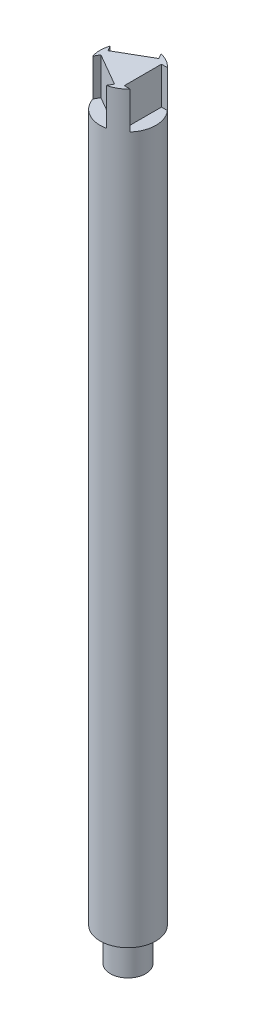
ISO-10303-21;
HEADER;
FILE_DESCRIPTION(('STEP AP214'),'2;1');
FILE_NAME('part.step','',(''),(''),'','','');
FILE_SCHEMA(('AUTOMOTIVE_DESIGN { 1 0 10303 214 1 1 1 1 }'));
ENDSEC;
DATA;
#1=APPLICATION_CONTEXT('core data for automotive mechanical design processes');
#2=APPLICATION_PROTOCOL_DEFINITION('international standard','automotive_design',2000,#1);
#3=PRODUCT_CONTEXT('',#1,'mechanical');
#4=PRODUCT('Part','Part','',(#3));
#5=PRODUCT_RELATED_PRODUCT_CATEGORY('part','',(#4));
#6=PRODUCT_DEFINITION_FORMATION('','',#4);
#7=PRODUCT_DEFINITION_CONTEXT('part definition',#1,'design');
#8=PRODUCT_DEFINITION('design','',#6,#7);
#9=PRODUCT_DEFINITION_SHAPE('','',#8);
#10=(LENGTH_UNIT() NAMED_UNIT(*) SI_UNIT(.MILLI.,.METRE.));
#11=(NAMED_UNIT(*) PLANE_ANGLE_UNIT() SI_UNIT($,.RADIAN.));
#12=(NAMED_UNIT(*) SI_UNIT($,.STERADIAN.) SOLID_ANGLE_UNIT());
#13=UNCERTAINTY_MEASURE_WITH_UNIT(LENGTH_MEASURE(1.E-05),#10,'distance_accuracy_value','');
#14=(GEOMETRIC_REPRESENTATION_CONTEXT(3) GLOBAL_UNCERTAINTY_ASSIGNED_CONTEXT((#13)) GLOBAL_UNIT_ASSIGNED_CONTEXT((#10,
#11,#12)) REPRESENTATION_CONTEXT('',''));
#15=CARTESIAN_POINT('',(0.,0.,0.));
#16=DIRECTION('',(0.,0.,1.));
#17=DIRECTION('',(1.,0.,0.));
#18=AXIS2_PLACEMENT_3D('',#15,#16,#17);
#19=CARTESIAN_POINT('',(0.,209.,0.));
#20=DIRECTION('',(0.,-1.,0.));
#21=DIRECTION('',(0.,0.,-1.));
#22=AXIS2_PLACEMENT_3D('',#19,#20,#21);
#23=CYLINDRICAL_SURFACE('',#22,7.5);
#24=CARTESIAN_POINT('',(0.,9.,0.));
#25=DIRECTION('',(0.,1.,0.));
#26=DIRECTION('',(0.,0.,1.));
#27=AXIS2_PLACEMENT_3D('',#24,#25,#26);
#28=CIRCLE('',#27,7.5);
#29=CARTESIAN_POINT('',(0.,9.,7.5));
#30=VERTEX_POINT('',#29);
#31=EDGE_CURVE('E227',#30,#30,#28,.T.);
#32=ORIENTED_EDGE('',*,*,#31,.T.);
#33=EDGE_LOOP('',(#32));
#34=FACE_BOUND('',#33,.T.);
#35=DIRECTION('',(0.,-1.,0.));
#36=VECTOR('',#35,1.);
#37=CARTESIAN_POINT('',(1.53504204704742,209.,7.34122918275928));
#38=LINE('',#37,#36);
#39=CARTESIAN_POINT('',(1.53504204704742,199.,7.34122918275928));
#40=VERTEX_POINT('',#39);
#41=CARTESIAN_POINT('',(1.53504204704742,209.,7.34122918275928));
#42=VERTEX_POINT('',#41);
#43=EDGE_CURVE('E193',#40,#42,#38,.F.);
#44=ORIENTED_EDGE('',*,*,#43,.F.);
#45=CARTESIAN_POINT('',(0.,199.,0.));
#46=DIRECTION('',(0.,1.,0.));
#47=DIRECTION('',(0.,0.,1.));
#48=AXIS2_PLACEMENT_3D('',#45,#46,#47);
#49=CIRCLE('',#48,7.5);
#50=CARTESIAN_POINT('',(-7.12521199079694,199.,2.34122918275924));
#51=VERTEX_POINT('',#50);
#52=EDGE_CURVE('E11',#51,#40,#49,.T.);
#53=ORIENTED_EDGE('',*,*,#52,.F.);
#54=DIRECTION('',(0.,-1.,0.));
#55=VECTOR('',#54,1.);
#56=CARTESIAN_POINT('',(-7.12521199079694,209.,2.34122918275924));
#57=LINE('',#56,#55);
#58=CARTESIAN_POINT('',(-7.12521199079694,209.,2.34122918275924));
#59=VERTEX_POINT('',#58);
#60=EDGE_CURVE('E188',#59,#51,#57,.T.);
#61=ORIENTED_EDGE('',*,*,#60,.F.);
#62=CARTESIAN_POINT('',(0.,209.,0.));
#63=DIRECTION('',(0.,1.,0.));
#64=DIRECTION('',(0.,0.,1.));
#65=AXIS2_PLACEMENT_3D('',#62,#63,#64);
#66=CIRCLE('',#65,7.5);
#67=CARTESIAN_POINT('',(-7.12521199079691,209.,-2.34122918275934));
#68=VERTEX_POINT('',#67);
#69=EDGE_CURVE('E157',#68,#59,#66,.T.);
#70=ORIENTED_EDGE('',*,*,#69,.F.);
#71=DIRECTION('',(0.,-1.,0.));
#72=VECTOR('',#71,1.);
#73=CARTESIAN_POINT('',(-7.12521199079691,209.,-2.34122918275934));
#74=LINE('',#73,#72);
#75=CARTESIAN_POINT('',(-7.12521199079691,199.,-2.34122918275934));
#76=VERTEX_POINT('',#75);
#77=EDGE_CURVE('E182',#76,#68,#74,.F.);
#78=ORIENTED_EDGE('',*,*,#77,.F.);
#79=CARTESIAN_POINT('',(0.,199.,0.));
#80=DIRECTION('',(0.,1.,0.));
#81=DIRECTION('',(0.,0.,1.));
#82=AXIS2_PLACEMENT_3D('',#79,#80,#81);
#83=CIRCLE('',#82,7.5);
#84=CARTESIAN_POINT('',(1.53504204704752,199.,-7.34122918275926));
#85=VERTEX_POINT('',#84);
#86=EDGE_CURVE('E53',#85,#76,#83,.T.);
#87=ORIENTED_EDGE('',*,*,#86,.F.);
#88=DIRECTION('',(0.,-1.,0.));
#89=VECTOR('',#88,1.);
#90=CARTESIAN_POINT('',(1.53504204704752,209.,-7.34122918275926));
#91=LINE('',#90,#89);
#92=CARTESIAN_POINT('',(1.53504204704752,209.,-7.34122918275926));
#93=VERTEX_POINT('',#92);
#94=EDGE_CURVE('E189',#93,#85,#91,.T.);
#95=ORIENTED_EDGE('',*,*,#94,.F.);
#96=CARTESIAN_POINT('',(5.59016994374948,209.,-5.));
#97=VERTEX_POINT('',#96);
#98=EDGE_CURVE('E228',#97,#93,#66,.T.);
#99=ORIENTED_EDGE('',*,*,#98,.F.);
#100=DIRECTION('',(0.,-1.,0.));
#101=VECTOR('',#100,1.);
#102=CARTESIAN_POINT('',(5.59016994374947,209.,-5.));
#103=LINE('',#102,#101);
#104=CARTESIAN_POINT('',(5.59016994374947,199.,-5.));
#105=VERTEX_POINT('',#104);
#106=EDGE_CURVE('E224',#105,#97,#103,.F.);
#107=ORIENTED_EDGE('',*,*,#106,.F.);
#108=CARTESIAN_POINT('',(0.,199.,0.));
#109=DIRECTION('',(0.,1.,0.));
#110=DIRECTION('',(0.,0.,1.));
#111=AXIS2_PLACEMENT_3D('',#108,#109,#110);
#112=CIRCLE('',#111,7.5);
#113=CARTESIAN_POINT('',(5.59016994374947,199.,5.));
#114=VERTEX_POINT('',#113);
#115=EDGE_CURVE('E252',#114,#105,#112,.T.);
#116=ORIENTED_EDGE('',*,*,#115,.F.);
#117=DIRECTION('',(0.,-1.,0.));
#118=VECTOR('',#117,1.);
#119=CARTESIAN_POINT('',(5.59016994374947,209.,5.));
#120=LINE('',#119,#118);
#121=CARTESIAN_POINT('',(5.59016994374948,209.,5.));
#122=VERTEX_POINT('',#121);
#123=EDGE_CURVE('E220',#122,#114,#120,.T.);
#124=ORIENTED_EDGE('',*,*,#123,.F.);
#125=EDGE_CURVE('E233',#42,#122,#66,.T.);
#126=ORIENTED_EDGE('',*,*,#125,.F.);
#127=EDGE_LOOP('',(#44,#53,#61,#70,#78,#87,#95,#99,#107,#116,#124,#126));
#128=FACE_BOUND('',#127,.T.);
#129=ADVANCED_FACE('F44',(#34,#128),#23,.T.);
#130=CARTESIAN_POINT('',(0.,209.,0.));
#131=DIRECTION('',(0.,1.,0.));
#132=DIRECTION('',(0.,0.,1.));
#133=AXIS2_PLACEMENT_3D('',#130,#131,#132);
#134=PLANE('',#133);
#135=DIRECTION('',(-0.866025403784436,0.,-0.500000000000004));
#136=VECTOR('',#135,1.);
#137=CARTESIAN_POINT('',(-6.3301270189222,209.,0.964101615137725));
#138=LINE('',#137,#136);
#139=CARTESIAN_POINT('',(2.33012701892217,209.,5.96410161513777));
#140=VERTEX_POINT('',#139);
#141=CARTESIAN_POINT('',(-6.3301270189222,209.,0.964101615137725));
#142=VERTEX_POINT('',#141);
#143=EDGE_CURVE('E134',#140,#142,#138,.T.);
#144=ORIENTED_EDGE('',*,*,#143,.F.);
#145=DIRECTION('',(-0.500000000000004,0.,0.866025403784436));
#146=VECTOR('',#145,1.);
#147=CARTESIAN_POINT('',(4.33012701892218,209.,2.50000000000002));
#148=LINE('',#147,#146);
#149=EDGE_CURVE('E159',#140,#42,#148,.T.);
#150=ORIENTED_EDGE('',*,*,#149,.T.);
#151=ORIENTED_EDGE('',*,*,#125,.T.);
#152=DIRECTION('',(-1.,0.,0.));
#153=VECTOR('',#152,1.);
#154=CARTESIAN_POINT('',(0.,209.,5.));
#155=LINE('',#154,#153);
#156=CARTESIAN_POINT('',(4.,209.,5.));
#157=VERTEX_POINT('',#156);
#158=EDGE_CURVE('E241',#122,#157,#155,.T.);
#159=ORIENTED_EDGE('',*,*,#158,.T.);
#160=DIRECTION('',(0.,0.,1.));
#161=VECTOR('',#160,1.);
#162=CARTESIAN_POINT('',(4.,209.,5.));
#163=LINE('',#162,#161);
#164=CARTESIAN_POINT('',(4.,209.,-5.));
#165=VERTEX_POINT('',#164);
#166=EDGE_CURVE('E203',#165,#157,#163,.T.);
#167=ORIENTED_EDGE('',*,*,#166,.F.);
#168=DIRECTION('',(1.,0.,0.));
#169=VECTOR('',#168,1.);
#170=CARTESIAN_POINT('',(0.,209.,-5.));
#171=LINE('',#170,#169);
#172=EDGE_CURVE('E248',#165,#97,#171,.T.);
#173=ORIENTED_EDGE('',*,*,#172,.T.);
#174=ORIENTED_EDGE('',*,*,#98,.T.);
#175=DIRECTION('',(0.499999999999992,0.,0.866025403784443));
#176=VECTOR('',#175,1.);
#177=CARTESIAN_POINT('',(4.33012701892222,209.,-2.49999999999996));
#178=LINE('',#177,#176);
#179=CARTESIAN_POINT('',(2.33012701892225,209.,-5.96410161513773));
#180=VERTEX_POINT('',#179);
#181=EDGE_CURVE('E165',#93,#180,#178,.T.);
#182=ORIENTED_EDGE('',*,*,#181,.T.);
#183=DIRECTION('',(0.866025403784443,0.,-0.499999999999992));
#184=VECTOR('',#183,1.);
#185=CARTESIAN_POINT('',(2.33012701892225,209.,-5.96410161513773));
#186=LINE('',#185,#184);
#187=CARTESIAN_POINT('',(-6.33012701892218,209.,-0.964101615137813));
#188=VERTEX_POINT('',#187);
#189=EDGE_CURVE('E257',#188,#180,#186,.T.);
#190=ORIENTED_EDGE('',*,*,#189,.F.);
#191=DIRECTION('',(-0.499999999999992,0.,-0.866025403784443));
#192=VECTOR('',#191,1.);
#193=CARTESIAN_POINT('',(-4.33012701892222,209.,2.49999999999996));
#194=LINE('',#193,#192);
#195=EDGE_CURVE('E160',#188,#68,#194,.T.);
#196=ORIENTED_EDGE('',*,*,#195,.T.);
#197=ORIENTED_EDGE('',*,*,#69,.T.);
#198=DIRECTION('',(0.500000000000004,0.,-0.866025403784436));
#199=VECTOR('',#198,1.);
#200=CARTESIAN_POINT('',(-4.33012701892218,209.,-2.50000000000002));
#201=LINE('',#200,#199);
#202=EDGE_CURVE('E146',#59,#142,#201,.T.);
#203=ORIENTED_EDGE('',*,*,#202,.T.);
#204=EDGE_LOOP('',(#144,#150,#151,#159,#167,#173,#174,#182,#190,#196,#197,#203));
#205=FACE_BOUND('',#204,.T.);
#206=ADVANCED_FACE('F154',(#205),#134,.T.);
#207=CARTESIAN_POINT('',(0.,9.,0.));
#208=DIRECTION('',(0.,-1.,0.));
#209=DIRECTION('',(0.,0.,-1.));
#210=AXIS2_PLACEMENT_3D('',#207,#208,#209);
#211=CYLINDRICAL_SURFACE('',#210,4.75);
#212=CARTESIAN_POINT('',(0.,9.,0.));
#213=DIRECTION('',(0.,1.,0.));
#214=DIRECTION('',(0.,0.,1.));
#215=AXIS2_PLACEMENT_3D('',#212,#213,#214);
#216=CIRCLE('',#215,4.75);
#217=CARTESIAN_POINT('',(0.,9.,4.75));
#218=VERTEX_POINT('',#217);
#219=EDGE_CURVE('E237',#218,#218,#216,.T.);
#220=ORIENTED_EDGE('',*,*,#219,.F.);
#221=EDGE_LOOP('',(#220));
#222=FACE_BOUND('',#221,.T.);
#223=CARTESIAN_POINT('',(0.,0.,0.));
#224=DIRECTION('',(0.,1.,0.));
#225=DIRECTION('',(0.,0.,1.));
#226=AXIS2_PLACEMENT_3D('',#223,#224,#225);
#227=CIRCLE('',#226,4.75);
#228=CARTESIAN_POINT('',(0.,0.,4.75));
#229=VERTEX_POINT('',#228);
#230=EDGE_CURVE('E232',#229,#229,#227,.T.);
#231=ORIENTED_EDGE('',*,*,#230,.T.);
#232=EDGE_LOOP('',(#231));
#233=FACE_BOUND('',#232,.T.);
#234=ADVANCED_FACE('F46',(#222,#233),#211,.T.);
#235=CARTESIAN_POINT('',(0.,0.,0.));
#236=DIRECTION('',(0.,1.,0.));
#237=DIRECTION('',(0.,0.,1.));
#238=AXIS2_PLACEMENT_3D('',#235,#236,#237);
#239=PLANE('',#238);
#240=ORIENTED_EDGE('',*,*,#230,.F.);
#241=EDGE_LOOP('',(#240));
#242=FACE_BOUND('',#241,.T.);
#243=ADVANCED_FACE('F290',(#242),#239,.F.);
#244=CARTESIAN_POINT('',(0.,9.,0.));
#245=DIRECTION('',(0.,1.,0.));
#246=DIRECTION('',(0.,0.,1.));
#247=AXIS2_PLACEMENT_3D('',#244,#245,#246);
#248=PLANE('',#247);
#249=ORIENTED_EDGE('',*,*,#219,.T.);
#250=EDGE_LOOP('',(#249));
#251=FACE_BOUND('',#250,.T.);
#252=ORIENTED_EDGE('',*,*,#31,.F.);
#253=EDGE_LOOP('',(#252));
#254=FACE_BOUND('',#253,.T.);
#255=ADVANCED_FACE('F283',(#251,#254),#248,.F.);
#256=CARTESIAN_POINT('',(7.5,199.,5.));
#257=DIRECTION('',(0.,1.,0.));
#258=DIRECTION('',(0.,0.,1.));
#259=AXIS2_PLACEMENT_3D('',#256,#257,#258);
#260=PLANE('',#259);
#261=DIRECTION('',(-1.,0.,0.));
#262=VECTOR('',#261,1.);
#263=CARTESIAN_POINT('',(7.5,199.,5.));
#264=LINE('',#263,#262);
#265=CARTESIAN_POINT('',(4.,199.,5.));
#266=VERTEX_POINT('',#265);
#267=EDGE_CURVE('E217',#114,#266,#264,.T.);
#268=ORIENTED_EDGE('',*,*,#267,.F.);
#269=ORIENTED_EDGE('',*,*,#115,.T.);
#270=DIRECTION('',(-1.,0.,0.));
#271=VECTOR('',#270,1.);
#272=CARTESIAN_POINT('',(7.5,199.,-5.));
#273=LINE('',#272,#271);
#274=CARTESIAN_POINT('',(4.,199.,-5.));
#275=VERTEX_POINT('',#274);
#276=EDGE_CURVE('E214',#105,#275,#273,.T.);
#277=ORIENTED_EDGE('',*,*,#276,.T.);
#278=DIRECTION('',(0.,0.,-1.));
#279=VECTOR('',#278,1.);
#280=CARTESIAN_POINT('',(4.,199.,5.));
#281=LINE('',#280,#279);
#282=EDGE_CURVE('E210',#266,#275,#281,.T.);
#283=ORIENTED_EDGE('',*,*,#282,.F.);
#284=EDGE_LOOP('',(#268,#269,#277,#283));
#285=FACE_BOUND('',#284,.T.);
#286=ADVANCED_FACE('F281',(#285),#260,.T.);
#287=CARTESIAN_POINT('',(7.5,199.,-5.));
#288=DIRECTION('',(0.,0.,1.));
#289=DIRECTION('',(1.,0.,0.));
#290=AXIS2_PLACEMENT_3D('',#287,#288,#289);
#291=PLANE('',#290);
#292=ORIENTED_EDGE('',*,*,#106,.T.);
#293=ORIENTED_EDGE('',*,*,#172,.F.);
#294=DIRECTION('',(0.,1.,0.));
#295=VECTOR('',#294,1.);
#296=CARTESIAN_POINT('',(4.,199.,-5.));
#297=LINE('',#296,#295);
#298=EDGE_CURVE('E200',#275,#165,#297,.T.);
#299=ORIENTED_EDGE('',*,*,#298,.F.);
#300=ORIENTED_EDGE('',*,*,#276,.F.);
#301=EDGE_LOOP('',(#292,#293,#299,#300));
#302=FACE_BOUND('',#301,.T.);
#303=ADVANCED_FACE('F269',(#302),#291,.T.);
#304=CARTESIAN_POINT('',(7.5,199.,5.));
#305=DIRECTION('',(0.,0.,-1.));
#306=DIRECTION('',(-1.,0.,0.));
#307=AXIS2_PLACEMENT_3D('',#304,#305,#306);
#308=PLANE('',#307);
#309=ORIENTED_EDGE('',*,*,#123,.T.);
#310=ORIENTED_EDGE('',*,*,#267,.T.);
#311=DIRECTION('',(0.,-1.,0.));
#312=VECTOR('',#311,1.);
#313=CARTESIAN_POINT('',(4.,199.,5.));
#314=LINE('',#313,#312);
#315=EDGE_CURVE('E206',#157,#266,#314,.T.);
#316=ORIENTED_EDGE('',*,*,#315,.F.);
#317=ORIENTED_EDGE('',*,*,#158,.F.);
#318=EDGE_LOOP('',(#309,#310,#316,#317));
#319=FACE_BOUND('',#318,.T.);
#320=ADVANCED_FACE('F278',(#319),#308,.T.);
#321=CARTESIAN_POINT('',(4.,0.,0.));
#322=DIRECTION('',(-1.,0.,0.));
#323=DIRECTION('',(0.,0.,1.));
#324=AXIS2_PLACEMENT_3D('',#321,#322,#323);
#325=PLANE('',#324);
#326=ORIENTED_EDGE('',*,*,#298,.T.);
#327=ORIENTED_EDGE('',*,*,#166,.T.);
#328=ORIENTED_EDGE('',*,*,#315,.T.);
#329=ORIENTED_EDGE('',*,*,#282,.T.);
#330=EDGE_LOOP('',(#326,#327,#328,#329));
#331=FACE_BOUND('',#330,.T.);
#332=ADVANCED_FACE('F275',(#331),#325,.F.);
#333=CARTESIAN_POINT('',(-0.792468245269333,199.,-11.3725952641916));
#334=DIRECTION('',(0.,1.,0.));
#335=DIRECTION('',(0.,0.,1.));
#336=AXIS2_PLACEMENT_3D('',#333,#334,#335);
#337=PLANE('',#336);
#338=ORIENTED_EDGE('',*,*,#86,.T.);
#339=DIRECTION('',(0.499999999999992,0.,0.866025403784443));
#340=VECTOR('',#339,1.);
#341=CARTESIAN_POINT('',(-9.45272228311377,199.,-6.37259526419171));
#342=LINE('',#341,#340);
#343=CARTESIAN_POINT('',(-6.33012701892218,199.,-0.964101615137813));
#344=VERTEX_POINT('',#343);
#345=EDGE_CURVE('E175',#76,#344,#342,.T.);
#346=ORIENTED_EDGE('',*,*,#345,.T.);
#347=DIRECTION('',(-0.866025403784443,0.,0.499999999999992));
#348=VECTOR('',#347,1.);
#349=CARTESIAN_POINT('',(2.33012701892225,199.,-5.96410161513773));
#350=LINE('',#349,#348);
#351=CARTESIAN_POINT('',(2.33012701892225,199.,-5.96410161513773));
#352=VERTEX_POINT('',#351);
#353=EDGE_CURVE('E184',#352,#344,#350,.T.);
#354=ORIENTED_EDGE('',*,*,#353,.F.);
#355=DIRECTION('',(0.499999999999992,0.,0.866025403784443));
#356=VECTOR('',#355,1.);
#357=CARTESIAN_POINT('',(-0.792468245269333,199.,-11.3725952641916));
#358=LINE('',#357,#356);
#359=EDGE_CURVE('E176',#85,#352,#358,.T.);
#360=ORIENTED_EDGE('',*,*,#359,.F.);
#361=EDGE_LOOP('',(#338,#346,#354,#360));
#362=FACE_BOUND('',#361,.T.);
#363=ADVANCED_FACE('F173',(#362),#337,.T.);
#364=CARTESIAN_POINT('',(-9.45272228311377,199.,-6.37259526419171));
#365=DIRECTION('',(0.866025403784443,0.,-0.499999999999992));
#366=DIRECTION('',(-0.499999999999992,0.,-0.866025403784443));
#367=AXIS2_PLACEMENT_3D('',#364,#365,#366);
#368=PLANE('',#367);
#369=ORIENTED_EDGE('',*,*,#77,.T.);
#370=ORIENTED_EDGE('',*,*,#195,.F.);
#371=DIRECTION('',(0.,1.,0.));
#372=VECTOR('',#371,1.);
#373=CARTESIAN_POINT('',(-6.33012701892218,199.,-0.964101615137813));
#374=LINE('',#373,#372);
#375=EDGE_CURVE('E68',#344,#188,#374,.T.);
#376=ORIENTED_EDGE('',*,*,#375,.F.);
#377=ORIENTED_EDGE('',*,*,#345,.F.);
#378=EDGE_LOOP('',(#369,#370,#376,#377));
#379=FACE_BOUND('',#378,.T.);
#380=ADVANCED_FACE('F181',(#379),#368,.T.);
#381=CARTESIAN_POINT('',(-0.792468245269333,199.,-11.3725952641916));
#382=DIRECTION('',(-0.866025403784443,0.,0.499999999999992));
#383=DIRECTION('',(0.499999999999992,0.,0.866025403784443));
#384=AXIS2_PLACEMENT_3D('',#381,#382,#383);
#385=PLANE('',#384);
#386=ORIENTED_EDGE('',*,*,#94,.T.);
#387=ORIENTED_EDGE('',*,*,#359,.T.);
#388=DIRECTION('',(0.,-1.,0.));
#389=VECTOR('',#388,1.);
#390=CARTESIAN_POINT('',(2.33012701892225,199.,-5.96410161513773));
#391=LINE('',#390,#389);
#392=EDGE_CURVE('E263',#180,#352,#391,.T.);
#393=ORIENTED_EDGE('',*,*,#392,.F.);
#394=ORIENTED_EDGE('',*,*,#181,.F.);
#395=EDGE_LOOP('',(#386,#387,#393,#394));
#396=FACE_BOUND('',#395,.T.);
#397=ADVANCED_FACE('F261',(#396),#385,.T.);
#398=CARTESIAN_POINT('',(-1.99999999999997,0.,-3.46410161513777));
#399=DIRECTION('',(0.499999999999992,0.,0.866025403784443));
#400=DIRECTION('',(0.866025403784443,0.,-0.499999999999992));
#401=AXIS2_PLACEMENT_3D('',#398,#399,#400);
#402=PLANE('',#401);
#403=ORIENTED_EDGE('',*,*,#375,.T.);
#404=ORIENTED_EDGE('',*,*,#189,.T.);
#405=ORIENTED_EDGE('',*,*,#392,.T.);
#406=ORIENTED_EDGE('',*,*,#353,.T.);
#407=EDGE_LOOP('',(#403,#404,#405,#406));
#408=FACE_BOUND('',#407,.T.);
#409=ADVANCED_FACE('F384',(#408),#402,.F.);
#410=CARTESIAN_POINT('',(-9.45272228311388,199.,6.37259526419161));
#411=DIRECTION('',(0.,1.,0.));
#412=DIRECTION('',(0.,0.,1.));
#413=AXIS2_PLACEMENT_3D('',#410,#411,#412);
#414=PLANE('',#413);
#415=ORIENTED_EDGE('',*,*,#52,.T.);
#416=DIRECTION('',(0.500000000000004,0.,-0.866025403784436));
#417=VECTOR('',#416,1.);
#418=CARTESIAN_POINT('',(-0.792468245269509,199.,11.3725952641917));
#419=LINE('',#418,#417);
#420=CARTESIAN_POINT('',(2.33012701892217,199.,5.96410161513777));
#421=VERTEX_POINT('',#420);
#422=EDGE_CURVE('E432',#40,#421,#419,.T.);
#423=ORIENTED_EDGE('',*,*,#422,.T.);
#424=DIRECTION('',(0.866025403784436,0.,0.500000000000004));
#425=VECTOR('',#424,1.);
#426=CARTESIAN_POINT('',(-6.3301270189222,199.,0.964101615137725));
#427=LINE('',#426,#425);
#428=CARTESIAN_POINT('',(-6.3301270189222,199.,0.964101615137725));
#429=VERTEX_POINT('',#428);
#430=EDGE_CURVE('E151',#429,#421,#427,.T.);
#431=ORIENTED_EDGE('',*,*,#430,.F.);
#432=DIRECTION('',(0.500000000000004,0.,-0.866025403784436));
#433=VECTOR('',#432,1.);
#434=CARTESIAN_POINT('',(-9.45272228311388,199.,6.37259526419161));
#435=LINE('',#434,#433);
#436=EDGE_CURVE('E149',#51,#429,#435,.T.);
#437=ORIENTED_EDGE('',*,*,#436,.F.);
#438=EDGE_LOOP('',(#415,#423,#431,#437));
#439=FACE_BOUND('',#438,.T.);
#440=ADVANCED_FACE('F393',(#439),#414,.T.);
#441=CARTESIAN_POINT('',(-0.792468245269509,199.,11.3725952641917));
#442=DIRECTION('',(-0.866025403784436,0.,-0.500000000000004));
#443=DIRECTION('',(-0.500000000000004,0.,0.866025403784436));
#444=AXIS2_PLACEMENT_3D('',#441,#442,#443);
#445=PLANE('',#444);
#446=ORIENTED_EDGE('',*,*,#43,.T.);
#447=ORIENTED_EDGE('',*,*,#149,.F.);
#448=DIRECTION('',(0.,1.,0.));
#449=VECTOR('',#448,1.);
#450=CARTESIAN_POINT('',(2.33012701892217,199.,5.96410161513777));
#451=LINE('',#450,#449);
#452=EDGE_CURVE('E60',#421,#140,#451,.T.);
#453=ORIENTED_EDGE('',*,*,#452,.F.);
#454=ORIENTED_EDGE('',*,*,#422,.F.);
#455=EDGE_LOOP('',(#446,#447,#453,#454));
#456=FACE_BOUND('',#455,.T.);
#457=ADVANCED_FACE('F402',(#456),#445,.T.);
#458=CARTESIAN_POINT('',(-9.45272228311388,199.,6.37259526419161));
#459=DIRECTION('',(0.866025403784436,0.,0.500000000000004));
#460=DIRECTION('',(0.500000000000004,0.,-0.866025403784436));
#461=AXIS2_PLACEMENT_3D('',#458,#459,#460);
#462=PLANE('',#461);
#463=ORIENTED_EDGE('',*,*,#60,.T.);
#464=ORIENTED_EDGE('',*,*,#436,.T.);
#465=DIRECTION('',(0.,-1.,0.));
#466=VECTOR('',#465,1.);
#467=CARTESIAN_POINT('',(-6.3301270189222,199.,0.964101615137725));
#468=LINE('',#467,#466);
#469=EDGE_CURVE('E137',#142,#429,#468,.T.);
#470=ORIENTED_EDGE('',*,*,#469,.F.);
#471=ORIENTED_EDGE('',*,*,#202,.F.);
#472=EDGE_LOOP('',(#463,#464,#470,#471));
#473=FACE_BOUND('',#472,.T.);
#474=ADVANCED_FACE('F145',(#473),#462,.T.);
#475=CARTESIAN_POINT('',(-2.00000000000002,0.,3.46410161513775));
#476=DIRECTION('',(0.500000000000004,0.,-0.866025403784436));
#477=DIRECTION('',(-0.866025403784436,0.,-0.500000000000004));
#478=AXIS2_PLACEMENT_3D('',#475,#476,#477);
#479=PLANE('',#478);
#480=ORIENTED_EDGE('',*,*,#452,.T.);
#481=ORIENTED_EDGE('',*,*,#143,.T.);
#482=ORIENTED_EDGE('',*,*,#469,.T.);
#483=ORIENTED_EDGE('',*,*,#430,.T.);
#484=EDGE_LOOP('',(#480,#481,#482,#483));
#485=FACE_BOUND('',#484,.T.);
#486=ADVANCED_FACE('F136',(#485),#479,.F.);
#487=CLOSED_SHELL('',(#129,#206,#234,#243,#255,#286,#303,#320,#332,#363,#380,#397,#409,#440,
#457,#474,#486));
#488=MANIFOLD_SOLID_BREP('B2',#487);
#489=ADVANCED_BREP_SHAPE_REPRESENTATION('',(#18,#488),#14);
#490=SHAPE_DEFINITION_REPRESENTATION(#9,#489);
ENDSEC;
END-ISO-10303-21;
